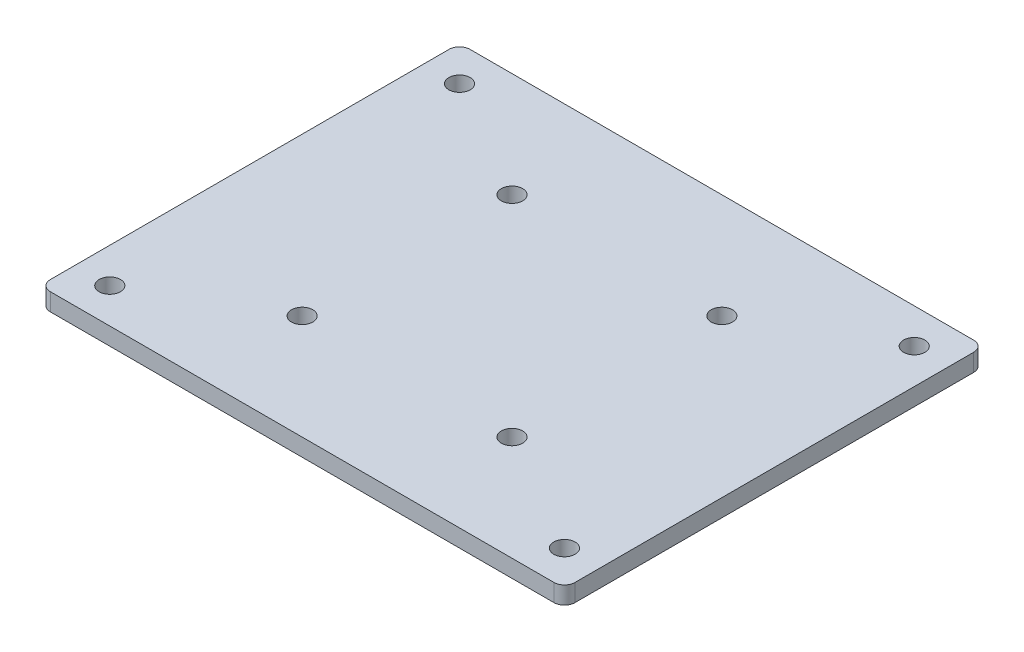
ISO-10303-21;
HEADER;
FILE_DESCRIPTION(('STEP AP214'),'2;1');
FILE_NAME('part.step','',(''),(''),'','','');
FILE_SCHEMA(('AUTOMOTIVE_DESIGN { 1 0 10303 214 1 1 1 1 }'));
ENDSEC;
DATA;
#1=APPLICATION_CONTEXT('core data for automotive mechanical design processes');
#2=APPLICATION_PROTOCOL_DEFINITION('international standard','automotive_design',2000,#1);
#3=PRODUCT_CONTEXT('',#1,'mechanical');
#4=PRODUCT('Part','Part','',(#3));
#5=PRODUCT_RELATED_PRODUCT_CATEGORY('part','',(#4));
#6=PRODUCT_DEFINITION_FORMATION('','',#4);
#7=PRODUCT_DEFINITION_CONTEXT('part definition',#1,'design');
#8=PRODUCT_DEFINITION('design','',#6,#7);
#9=PRODUCT_DEFINITION_SHAPE('','',#8);
#10=(LENGTH_UNIT() NAMED_UNIT(*) SI_UNIT(.MILLI.,.METRE.));
#11=(NAMED_UNIT(*) PLANE_ANGLE_UNIT() SI_UNIT($,.RADIAN.));
#12=(NAMED_UNIT(*) SI_UNIT($,.STERADIAN.) SOLID_ANGLE_UNIT());
#13=UNCERTAINTY_MEASURE_WITH_UNIT(LENGTH_MEASURE(1.E-05),#10,'distance_accuracy_value','');
#14=(GEOMETRIC_REPRESENTATION_CONTEXT(3) GLOBAL_UNCERTAINTY_ASSIGNED_CONTEXT((#13)) GLOBAL_UNIT_ASSIGNED_CONTEXT((#10,
#11,#12)) REPRESENTATION_CONTEXT('',''));
#15=CARTESIAN_POINT('',(0.,0.,0.));
#16=DIRECTION('',(0.,0.,1.));
#17=DIRECTION('',(1.,0.,0.));
#18=AXIS2_PLACEMENT_3D('',#15,#16,#17);
#19=CARTESIAN_POINT('',(75.,5.,-60.));
#20=DIRECTION('',(-1.,0.,0.));
#21=DIRECTION('',(0.,0.,1.));
#22=AXIS2_PLACEMENT_3D('',#19,#20,#21);
#23=PLANE('',#22);
#24=DIRECTION('',(0.,0.,-1.));
#25=VECTOR('',#24,1.);
#26=CARTESIAN_POINT('',(75.,0.,-60.));
#27=LINE('',#26,#25);
#28=CARTESIAN_POINT('',(75.,0.,57.));
#29=VERTEX_POINT('',#28);
#30=CARTESIAN_POINT('',(75.,0.,-57.));
#31=VERTEX_POINT('',#30);
#32=EDGE_CURVE('E140',#29,#31,#27,.T.);
#33=ORIENTED_EDGE('',*,*,#32,.T.);
#34=DIRECTION('',(0.,-1.,0.));
#35=VECTOR('',#34,1.);
#36=CARTESIAN_POINT('',(75.,5.,-57.));
#37=LINE('',#36,#35);
#38=CARTESIAN_POINT('',(75.,5.,-57.));
#39=VERTEX_POINT('',#38);
#40=EDGE_CURVE('E188',#31,#39,#37,.F.);
#41=ORIENTED_EDGE('',*,*,#40,.T.);
#42=DIRECTION('',(0.,0.,-1.));
#43=VECTOR('',#42,1.);
#44=CARTESIAN_POINT('',(75.,5.,-60.));
#45=LINE('',#44,#43);
#46=CARTESIAN_POINT('',(75.,5.,57.));
#47=VERTEX_POINT('',#46);
#48=EDGE_CURVE('E138',#47,#39,#45,.T.);
#49=ORIENTED_EDGE('',*,*,#48,.F.);
#50=DIRECTION('',(0.,-1.,0.));
#51=VECTOR('',#50,1.);
#52=CARTESIAN_POINT('',(75.,5.,57.));
#53=LINE('',#52,#51);
#54=EDGE_CURVE('E185',#47,#29,#53,.T.);
#55=ORIENTED_EDGE('',*,*,#54,.T.);
#56=EDGE_LOOP('',(#33,#41,#49,#55));
#57=FACE_BOUND('',#56,.T.);
#58=ADVANCED_FACE('F45',(#57),#23,.F.);
#59=CARTESIAN_POINT('',(-75.,5.,-60.));
#60=DIRECTION('',(0.,0.,1.));
#61=DIRECTION('',(1.,0.,0.));
#62=AXIS2_PLACEMENT_3D('',#59,#60,#61);
#63=PLANE('',#62);
#64=DIRECTION('',(-1.,0.,0.));
#65=VECTOR('',#64,1.);
#66=CARTESIAN_POINT('',(-75.,0.,-60.));
#67=LINE('',#66,#65);
#68=CARTESIAN_POINT('',(72.,0.,-60.));
#69=VERTEX_POINT('',#68);
#70=CARTESIAN_POINT('',(-72.,0.,-60.));
#71=VERTEX_POINT('',#70);
#72=EDGE_CURVE('E136',#69,#71,#67,.T.);
#73=ORIENTED_EDGE('',*,*,#72,.T.);
#74=DIRECTION('',(0.,-1.,0.));
#75=VECTOR('',#74,1.);
#76=CARTESIAN_POINT('',(-72.,5.,-60.));
#77=LINE('',#76,#75);
#78=CARTESIAN_POINT('',(-72.,5.,-60.));
#79=VERTEX_POINT('',#78);
#80=EDGE_CURVE('E115',#71,#79,#77,.F.);
#81=ORIENTED_EDGE('',*,*,#80,.T.);
#82=DIRECTION('',(-1.,0.,0.));
#83=VECTOR('',#82,1.);
#84=CARTESIAN_POINT('',(-75.,5.,-60.));
#85=LINE('',#84,#83);
#86=CARTESIAN_POINT('',(72.,5.,-60.));
#87=VERTEX_POINT('',#86);
#88=EDGE_CURVE('E204',#87,#79,#85,.T.);
#89=ORIENTED_EDGE('',*,*,#88,.F.);
#90=DIRECTION('',(0.,-1.,0.));
#91=VECTOR('',#90,1.);
#92=CARTESIAN_POINT('',(72.,5.,-60.));
#93=LINE('',#92,#91);
#94=EDGE_CURVE('E120',#87,#69,#93,.T.);
#95=ORIENTED_EDGE('',*,*,#94,.T.);
#96=EDGE_LOOP('',(#73,#81,#89,#95));
#97=FACE_BOUND('',#96,.T.);
#98=ADVANCED_FACE('F229',(#97),#63,.F.);
#99=CARTESIAN_POINT('',(-75.,5.,-60.));
#100=DIRECTION('',(1.,0.,0.));
#101=DIRECTION('',(0.,0.,-1.));
#102=AXIS2_PLACEMENT_3D('',#99,#100,#101);
#103=PLANE('',#102);
#104=DIRECTION('',(0.,0.,1.));
#105=VECTOR('',#104,1.);
#106=CARTESIAN_POINT('',(-75.,5.,-60.));
#107=LINE('',#106,#105);
#108=CARTESIAN_POINT('',(-75.,5.,-57.));
#109=VERTEX_POINT('',#108);
#110=CARTESIAN_POINT('',(-75.,5.,57.));
#111=VERTEX_POINT('',#110);
#112=EDGE_CURVE('E129',#109,#111,#107,.T.);
#113=ORIENTED_EDGE('',*,*,#112,.F.);
#114=DIRECTION('',(0.,-1.,0.));
#115=VECTOR('',#114,1.);
#116=CARTESIAN_POINT('',(-75.,5.,-57.));
#117=LINE('',#116,#115);
#118=CARTESIAN_POINT('',(-75.,0.,-57.));
#119=VERTEX_POINT('',#118);
#120=EDGE_CURVE('E114',#109,#119,#117,.T.);
#121=ORIENTED_EDGE('',*,*,#120,.T.);
#122=DIRECTION('',(0.,0.,1.));
#123=VECTOR('',#122,1.);
#124=CARTESIAN_POINT('',(-75.,0.,-60.));
#125=LINE('',#124,#123);
#126=CARTESIAN_POINT('',(-75.,0.,57.));
#127=VERTEX_POINT('',#126);
#128=EDGE_CURVE('E127',#119,#127,#125,.T.);
#129=ORIENTED_EDGE('',*,*,#128,.T.);
#130=DIRECTION('',(0.,-1.,0.));
#131=VECTOR('',#130,1.);
#132=CARTESIAN_POINT('',(-75.,5.,57.));
#133=LINE('',#132,#131);
#134=EDGE_CURVE('E131',#127,#111,#133,.F.);
#135=ORIENTED_EDGE('',*,*,#134,.T.);
#136=EDGE_LOOP('',(#113,#121,#129,#135));
#137=FACE_BOUND('',#136,.T.);
#138=ADVANCED_FACE('F126',(#137),#103,.F.);
#139=CARTESIAN_POINT('',(-75.,5.,60.));
#140=DIRECTION('',(0.,0.,-1.));
#141=DIRECTION('',(-1.,0.,0.));
#142=AXIS2_PLACEMENT_3D('',#139,#140,#141);
#143=PLANE('',#142);
#144=DIRECTION('',(1.,0.,0.));
#145=VECTOR('',#144,1.);
#146=CARTESIAN_POINT('',(-75.,0.,60.));
#147=LINE('',#146,#145);
#148=CARTESIAN_POINT('',(-72.,0.,60.));
#149=VERTEX_POINT('',#148);
#150=CARTESIAN_POINT('',(72.,0.,60.));
#151=VERTEX_POINT('',#150);
#152=EDGE_CURVE('E135',#149,#151,#147,.T.);
#153=ORIENTED_EDGE('',*,*,#152,.T.);
#154=DIRECTION('',(0.,-1.,0.));
#155=VECTOR('',#154,1.);
#156=CARTESIAN_POINT('',(72.,5.,60.));
#157=LINE('',#156,#155);
#158=CARTESIAN_POINT('',(72.,5.,60.));
#159=VERTEX_POINT('',#158);
#160=EDGE_CURVE('E11',#151,#159,#157,.F.);
#161=ORIENTED_EDGE('',*,*,#160,.T.);
#162=DIRECTION('',(1.,0.,0.));
#163=VECTOR('',#162,1.);
#164=CARTESIAN_POINT('',(-75.,5.,60.));
#165=LINE('',#164,#163);
#166=CARTESIAN_POINT('',(-72.,5.,60.));
#167=VERTEX_POINT('',#166);
#168=EDGE_CURVE('E169',#167,#159,#165,.T.);
#169=ORIENTED_EDGE('',*,*,#168,.F.);
#170=DIRECTION('',(0.,-1.,0.));
#171=VECTOR('',#170,1.);
#172=CARTESIAN_POINT('',(-72.,5.,60.));
#173=LINE('',#172,#171);
#174=EDGE_CURVE('E53',#167,#149,#173,.T.);
#175=ORIENTED_EDGE('',*,*,#174,.T.);
#176=EDGE_LOOP('',(#153,#161,#169,#175));
#177=FACE_BOUND('',#176,.T.);
#178=ADVANCED_FACE('F191',(#177),#143,.F.);
#179=CARTESIAN_POINT('',(0.,5.,0.));
#180=DIRECTION('',(0.,1.,0.));
#181=DIRECTION('',(0.,0.,1.));
#182=AXIS2_PLACEMENT_3D('',#179,#180,#181);
#183=PLANE('',#182);
#184=CARTESIAN_POINT('',(30.,5.,-30.));
#185=DIRECTION('',(0.,1.,0.));
#186=DIRECTION('',(0.,0.,1.));
#187=AXIS2_PLACEMENT_3D('',#184,#185,#186);
#188=CIRCLE('',#187,3.05);
#189=CARTESIAN_POINT('',(30.,5.,-26.95));
#190=VERTEX_POINT('',#189);
#191=EDGE_CURVE('E386',#190,#190,#188,.T.);
#192=ORIENTED_EDGE('',*,*,#191,.F.);
#193=EDGE_LOOP('',(#192));
#194=FACE_BOUND('',#193,.T.);
#195=CARTESIAN_POINT('',(30.,5.,30.));
#196=DIRECTION('',(0.,1.,0.));
#197=DIRECTION('',(0.,0.,1.));
#198=AXIS2_PLACEMENT_3D('',#195,#196,#197);
#199=CIRCLE('',#198,3.05);
#200=CARTESIAN_POINT('',(30.,5.,33.05));
#201=VERTEX_POINT('',#200);
#202=EDGE_CURVE('E388',#201,#201,#199,.T.);
#203=ORIENTED_EDGE('',*,*,#202,.F.);
#204=EDGE_LOOP('',(#203));
#205=FACE_BOUND('',#204,.T.);
#206=CARTESIAN_POINT('',(-30.,5.,30.));
#207=DIRECTION('',(0.,1.,0.));
#208=DIRECTION('',(0.,0.,1.));
#209=AXIS2_PLACEMENT_3D('',#206,#207,#208);
#210=CIRCLE('',#209,3.05);
#211=CARTESIAN_POINT('',(-30.,5.,33.05));
#212=VERTEX_POINT('',#211);
#213=EDGE_CURVE('E391',#212,#212,#210,.T.);
#214=ORIENTED_EDGE('',*,*,#213,.F.);
#215=EDGE_LOOP('',(#214));
#216=FACE_BOUND('',#215,.T.);
#217=CARTESIAN_POINT('',(-65.,5.,-50.));
#218=DIRECTION('',(0.,1.,0.));
#219=DIRECTION('',(0.,0.,1.));
#220=AXIS2_PLACEMENT_3D('',#217,#218,#219);
#221=CIRCLE('',#220,3.05);
#222=CARTESIAN_POINT('',(-65.,5.,-46.95));
#223=VERTEX_POINT('',#222);
#224=EDGE_CURVE('E398',#223,#223,#221,.T.);
#225=ORIENTED_EDGE('',*,*,#224,.F.);
#226=EDGE_LOOP('',(#225));
#227=FACE_BOUND('',#226,.T.);
#228=CARTESIAN_POINT('',(65.,5.,50.));
#229=DIRECTION('',(0.,1.,0.));
#230=DIRECTION('',(0.,0.,1.));
#231=AXIS2_PLACEMENT_3D('',#228,#229,#230);
#232=CIRCLE('',#231,3.04999999999999);
#233=CARTESIAN_POINT('',(65.,5.,53.05));
#234=VERTEX_POINT('',#233);
#235=EDGE_CURVE('E405',#234,#234,#232,.T.);
#236=ORIENTED_EDGE('',*,*,#235,.F.);
#237=EDGE_LOOP('',(#236));
#238=FACE_BOUND('',#237,.T.);
#239=CARTESIAN_POINT('',(-65.,5.,50.));
#240=DIRECTION('',(0.,1.,0.));
#241=DIRECTION('',(0.,0.,1.));
#242=AXIS2_PLACEMENT_3D('',#239,#240,#241);
#243=CIRCLE('',#242,3.05);
#244=CARTESIAN_POINT('',(-65.,5.,53.05));
#245=VERTEX_POINT('',#244);
#246=EDGE_CURVE('E394',#245,#245,#243,.T.);
#247=ORIENTED_EDGE('',*,*,#246,.F.);
#248=EDGE_LOOP('',(#247));
#249=FACE_BOUND('',#248,.T.);
#250=CARTESIAN_POINT('',(65.,5.,-50.));
#251=DIRECTION('',(0.,1.,0.));
#252=DIRECTION('',(0.,0.,1.));
#253=AXIS2_PLACEMENT_3D('',#250,#251,#252);
#254=CIRCLE('',#253,3.04999999999999);
#255=CARTESIAN_POINT('',(65.,5.,-46.95));
#256=VERTEX_POINT('',#255);
#257=EDGE_CURVE('E400',#256,#256,#254,.T.);
#258=ORIENTED_EDGE('',*,*,#257,.F.);
#259=EDGE_LOOP('',(#258));
#260=FACE_BOUND('',#259,.T.);
#261=CARTESIAN_POINT('',(-30.,5.,-30.));
#262=DIRECTION('',(0.,1.,0.));
#263=DIRECTION('',(0.,0.,1.));
#264=AXIS2_PLACEMENT_3D('',#261,#262,#263);
#265=CIRCLE('',#264,3.05);
#266=CARTESIAN_POINT('',(-30.,5.,-26.95));
#267=VERTEX_POINT('',#266);
#268=EDGE_CURVE('E148',#267,#267,#265,.T.);
#269=ORIENTED_EDGE('',*,*,#268,.F.);
#270=EDGE_LOOP('',(#269));
#271=FACE_BOUND('',#270,.T.);
#272=ORIENTED_EDGE('',*,*,#88,.T.);
#273=CARTESIAN_POINT('',(-72.,5.,-57.));
#274=DIRECTION('',(0.,1.,0.));
#275=DIRECTION('',(0.,0.,1.));
#276=AXIS2_PLACEMENT_3D('',#273,#274,#275);
#277=CIRCLE('',#276,3.);
#278=EDGE_CURVE('E183',#79,#109,#277,.T.);
#279=ORIENTED_EDGE('',*,*,#278,.T.);
#280=ORIENTED_EDGE('',*,*,#112,.T.);
#281=CARTESIAN_POINT('',(-72.,5.,57.));
#282=DIRECTION('',(0.,1.,0.));
#283=DIRECTION('',(0.,0.,1.));
#284=AXIS2_PLACEMENT_3D('',#281,#282,#283);
#285=CIRCLE('',#284,3.);
#286=EDGE_CURVE('E65',#111,#167,#285,.T.);
#287=ORIENTED_EDGE('',*,*,#286,.T.);
#288=ORIENTED_EDGE('',*,*,#168,.T.);
#289=CARTESIAN_POINT('',(72.,5.,57.));
#290=DIRECTION('',(0.,1.,0.));
#291=DIRECTION('',(0.,0.,1.));
#292=AXIS2_PLACEMENT_3D('',#289,#290,#291);
#293=CIRCLE('',#292,3.);
#294=EDGE_CURVE('E179',#159,#47,#293,.T.);
#295=ORIENTED_EDGE('',*,*,#294,.T.);
#296=ORIENTED_EDGE('',*,*,#48,.T.);
#297=CARTESIAN_POINT('',(72.,5.,-57.));
#298=DIRECTION('',(0.,1.,0.));
#299=DIRECTION('',(0.,0.,1.));
#300=AXIS2_PLACEMENT_3D('',#297,#298,#299);
#301=CIRCLE('',#300,3.);
#302=EDGE_CURVE('E181',#39,#87,#301,.T.);
#303=ORIENTED_EDGE('',*,*,#302,.T.);
#304=EDGE_LOOP('',(#272,#279,#280,#287,#288,#295,#296,#303));
#305=FACE_BOUND('',#304,.T.);
#306=ADVANCED_FACE('F212',(#194,#205,#216,#227,#238,#249,#260,#271,#305),#183,.T.);
#307=CARTESIAN_POINT('',(0.,0.,0.));
#308=DIRECTION('',(0.,1.,0.));
#309=DIRECTION('',(0.,0.,1.));
#310=AXIS2_PLACEMENT_3D('',#307,#308,#309);
#311=PLANE('',#310);
#312=CARTESIAN_POINT('',(30.,0.,-30.));
#313=DIRECTION('',(0.,1.,0.));
#314=DIRECTION('',(0.,0.,1.));
#315=AXIS2_PLACEMENT_3D('',#312,#313,#314);
#316=CIRCLE('',#315,3.05);
#317=CARTESIAN_POINT('',(30.,0.,-26.95));
#318=VERTEX_POINT('',#317);
#319=EDGE_CURVE('E166',#318,#318,#316,.T.);
#320=ORIENTED_EDGE('',*,*,#319,.T.);
#321=EDGE_LOOP('',(#320));
#322=FACE_BOUND('',#321,.T.);
#323=CARTESIAN_POINT('',(30.,0.,30.));
#324=DIRECTION('',(0.,1.,0.));
#325=DIRECTION('',(0.,0.,1.));
#326=AXIS2_PLACEMENT_3D('',#323,#324,#325);
#327=CIRCLE('',#326,3.05);
#328=CARTESIAN_POINT('',(30.,0.,33.05));
#329=VERTEX_POINT('',#328);
#330=EDGE_CURVE('E163',#329,#329,#327,.T.);
#331=ORIENTED_EDGE('',*,*,#330,.T.);
#332=EDGE_LOOP('',(#331));
#333=FACE_BOUND('',#332,.T.);
#334=CARTESIAN_POINT('',(-30.,0.,30.));
#335=DIRECTION('',(0.,1.,0.));
#336=DIRECTION('',(0.,0.,1.));
#337=AXIS2_PLACEMENT_3D('',#334,#335,#336);
#338=CIRCLE('',#337,3.05);
#339=CARTESIAN_POINT('',(-30.,0.,33.05));
#340=VERTEX_POINT('',#339);
#341=EDGE_CURVE('E160',#340,#340,#338,.T.);
#342=ORIENTED_EDGE('',*,*,#341,.T.);
#343=EDGE_LOOP('',(#342));
#344=FACE_BOUND('',#343,.T.);
#345=CARTESIAN_POINT('',(-65.,0.,-50.));
#346=DIRECTION('',(0.,1.,0.));
#347=DIRECTION('',(0.,0.,1.));
#348=AXIS2_PLACEMENT_3D('',#345,#346,#347);
#349=CIRCLE('',#348,3.05);
#350=CARTESIAN_POINT('',(-65.,0.,-46.95));
#351=VERTEX_POINT('',#350);
#352=EDGE_CURVE('E157',#351,#351,#349,.T.);
#353=ORIENTED_EDGE('',*,*,#352,.T.);
#354=EDGE_LOOP('',(#353));
#355=FACE_BOUND('',#354,.T.);
#356=CARTESIAN_POINT('',(65.,0.,50.));
#357=DIRECTION('',(0.,1.,0.));
#358=DIRECTION('',(0.,0.,1.));
#359=AXIS2_PLACEMENT_3D('',#356,#357,#358);
#360=CIRCLE('',#359,3.04999999999999);
#361=CARTESIAN_POINT('',(65.,0.,53.05));
#362=VERTEX_POINT('',#361);
#363=EDGE_CURVE('E154',#362,#362,#360,.T.);
#364=ORIENTED_EDGE('',*,*,#363,.T.);
#365=EDGE_LOOP('',(#364));
#366=FACE_BOUND('',#365,.T.);
#367=CARTESIAN_POINT('',(-65.,0.,50.));
#368=DIRECTION('',(0.,1.,0.));
#369=DIRECTION('',(0.,0.,1.));
#370=AXIS2_PLACEMENT_3D('',#367,#368,#369);
#371=CIRCLE('',#370,3.05);
#372=CARTESIAN_POINT('',(-65.,0.,53.05));
#373=VERTEX_POINT('',#372);
#374=EDGE_CURVE('E151',#373,#373,#371,.T.);
#375=ORIENTED_EDGE('',*,*,#374,.T.);
#376=EDGE_LOOP('',(#375));
#377=FACE_BOUND('',#376,.T.);
#378=CARTESIAN_POINT('',(65.,0.,-50.));
#379=DIRECTION('',(0.,1.,0.));
#380=DIRECTION('',(0.,0.,1.));
#381=AXIS2_PLACEMENT_3D('',#378,#379,#380);
#382=CIRCLE('',#381,3.04999999999999);
#383=CARTESIAN_POINT('',(65.,0.,-46.95));
#384=VERTEX_POINT('',#383);
#385=EDGE_CURVE('E147',#384,#384,#382,.T.);
#386=ORIENTED_EDGE('',*,*,#385,.T.);
#387=EDGE_LOOP('',(#386));
#388=FACE_BOUND('',#387,.T.);
#389=CARTESIAN_POINT('',(-30.,0.,-30.));
#390=DIRECTION('',(0.,1.,0.));
#391=DIRECTION('',(0.,0.,1.));
#392=AXIS2_PLACEMENT_3D('',#389,#390,#391);
#393=CIRCLE('',#392,3.05);
#394=CARTESIAN_POINT('',(-30.,0.,-26.95));
#395=VERTEX_POINT('',#394);
#396=EDGE_CURVE('E144',#395,#395,#393,.T.);
#397=ORIENTED_EDGE('',*,*,#396,.T.);
#398=EDGE_LOOP('',(#397));
#399=FACE_BOUND('',#398,.T.);
#400=ORIENTED_EDGE('',*,*,#128,.F.);
#401=CARTESIAN_POINT('',(-72.,0.,-57.));
#402=DIRECTION('',(0.,1.,0.));
#403=DIRECTION('',(0.,0.,1.));
#404=AXIS2_PLACEMENT_3D('',#401,#402,#403);
#405=CIRCLE('',#404,3.);
#406=EDGE_CURVE('E110',#119,#71,#405,.F.);
#407=ORIENTED_EDGE('',*,*,#406,.T.);
#408=ORIENTED_EDGE('',*,*,#72,.F.);
#409=CARTESIAN_POINT('',(72.,0.,-57.));
#410=DIRECTION('',(0.,1.,0.));
#411=DIRECTION('',(0.,0.,1.));
#412=AXIS2_PLACEMENT_3D('',#409,#410,#411);
#413=CIRCLE('',#412,3.);
#414=EDGE_CURVE('E121',#69,#31,#413,.F.);
#415=ORIENTED_EDGE('',*,*,#414,.T.);
#416=ORIENTED_EDGE('',*,*,#32,.F.);
#417=CARTESIAN_POINT('',(72.,0.,57.));
#418=DIRECTION('',(0.,1.,0.));
#419=DIRECTION('',(0.,0.,1.));
#420=AXIS2_PLACEMENT_3D('',#417,#418,#419);
#421=CIRCLE('',#420,3.);
#422=EDGE_CURVE('E172',#29,#151,#421,.F.);
#423=ORIENTED_EDGE('',*,*,#422,.T.);
#424=ORIENTED_EDGE('',*,*,#152,.F.);
#425=CARTESIAN_POINT('',(-72.,0.,57.));
#426=DIRECTION('',(0.,1.,0.));
#427=DIRECTION('',(0.,0.,1.));
#428=AXIS2_PLACEMENT_3D('',#425,#426,#427);
#429=CIRCLE('',#428,3.);
#430=EDGE_CURVE('E130',#149,#127,#429,.F.);
#431=ORIENTED_EDGE('',*,*,#430,.T.);
#432=EDGE_LOOP('',(#400,#407,#408,#415,#416,#423,#424,#431));
#433=FACE_BOUND('',#432,.T.);
#434=ADVANCED_FACE('F133',(#322,#333,#344,#355,#366,#377,#388,#399,#433),#311,.F.);
#435=CARTESIAN_POINT('',(-30.,-5.,-30.));
#436=DIRECTION('',(0.,1.,0.));
#437=DIRECTION('',(0.,0.,1.));
#438=AXIS2_PLACEMENT_3D('',#435,#436,#437);
#439=CYLINDRICAL_SURFACE('',#438,3.05);
#440=ORIENTED_EDGE('',*,*,#268,.T.);
#441=EDGE_LOOP('',(#440));
#442=FACE_BOUND('',#441,.T.);
#443=ORIENTED_EDGE('',*,*,#396,.F.);
#444=EDGE_LOOP('',(#443));
#445=FACE_BOUND('',#444,.T.);
#446=ADVANCED_FACE('F221',(#442,#445),#439,.F.);
#447=CARTESIAN_POINT('',(65.,-5.,-50.));
#448=DIRECTION('',(0.,1.,0.));
#449=DIRECTION('',(0.,0.,1.));
#450=AXIS2_PLACEMENT_3D('',#447,#448,#449);
#451=CYLINDRICAL_SURFACE('',#450,3.04999999999999);
#452=ORIENTED_EDGE('',*,*,#257,.T.);
#453=EDGE_LOOP('',(#452));
#454=FACE_BOUND('',#453,.T.);
#455=ORIENTED_EDGE('',*,*,#385,.F.);
#456=EDGE_LOOP('',(#455));
#457=FACE_BOUND('',#456,.T.);
#458=ADVANCED_FACE('F326',(#454,#457),#451,.F.);
#459=CARTESIAN_POINT('',(-65.,-5.,50.));
#460=DIRECTION('',(0.,1.,0.));
#461=DIRECTION('',(0.,0.,1.));
#462=AXIS2_PLACEMENT_3D('',#459,#460,#461);
#463=CYLINDRICAL_SURFACE('',#462,3.05);
#464=ORIENTED_EDGE('',*,*,#246,.T.);
#465=EDGE_LOOP('',(#464));
#466=FACE_BOUND('',#465,.T.);
#467=ORIENTED_EDGE('',*,*,#374,.F.);
#468=EDGE_LOOP('',(#467));
#469=FACE_BOUND('',#468,.T.);
#470=ADVANCED_FACE('F316',(#466,#469),#463,.F.);
#471=CARTESIAN_POINT('',(65.,-5.,50.));
#472=DIRECTION('',(0.,1.,0.));
#473=DIRECTION('',(0.,0.,1.));
#474=AXIS2_PLACEMENT_3D('',#471,#472,#473);
#475=CYLINDRICAL_SURFACE('',#474,3.04999999999999);
#476=ORIENTED_EDGE('',*,*,#235,.T.);
#477=EDGE_LOOP('',(#476));
#478=FACE_BOUND('',#477,.T.);
#479=ORIENTED_EDGE('',*,*,#363,.F.);
#480=EDGE_LOOP('',(#479));
#481=FACE_BOUND('',#480,.T.);
#482=ADVANCED_FACE('F306',(#478,#481),#475,.F.);
#483=CARTESIAN_POINT('',(-65.,-5.,-50.));
#484=DIRECTION('',(0.,1.,0.));
#485=DIRECTION('',(0.,0.,1.));
#486=AXIS2_PLACEMENT_3D('',#483,#484,#485);
#487=CYLINDRICAL_SURFACE('',#486,3.05);
#488=ORIENTED_EDGE('',*,*,#224,.T.);
#489=EDGE_LOOP('',(#488));
#490=FACE_BOUND('',#489,.T.);
#491=ORIENTED_EDGE('',*,*,#352,.F.);
#492=EDGE_LOOP('',(#491));
#493=FACE_BOUND('',#492,.T.);
#494=ADVANCED_FACE('F296',(#490,#493),#487,.F.);
#495=CARTESIAN_POINT('',(-30.,-5.,30.));
#496=DIRECTION('',(0.,1.,0.));
#497=DIRECTION('',(0.,0.,1.));
#498=AXIS2_PLACEMENT_3D('',#495,#496,#497);
#499=CYLINDRICAL_SURFACE('',#498,3.05);
#500=ORIENTED_EDGE('',*,*,#213,.T.);
#501=EDGE_LOOP('',(#500));
#502=FACE_BOUND('',#501,.T.);
#503=ORIENTED_EDGE('',*,*,#341,.F.);
#504=EDGE_LOOP('',(#503));
#505=FACE_BOUND('',#504,.T.);
#506=ADVANCED_FACE('F286',(#502,#505),#499,.F.);
#507=CARTESIAN_POINT('',(30.,-5.,30.));
#508=DIRECTION('',(0.,1.,0.));
#509=DIRECTION('',(0.,0.,1.));
#510=AXIS2_PLACEMENT_3D('',#507,#508,#509);
#511=CYLINDRICAL_SURFACE('',#510,3.05);
#512=ORIENTED_EDGE('',*,*,#202,.T.);
#513=EDGE_LOOP('',(#512));
#514=FACE_BOUND('',#513,.T.);
#515=ORIENTED_EDGE('',*,*,#330,.F.);
#516=EDGE_LOOP('',(#515));
#517=FACE_BOUND('',#516,.T.);
#518=ADVANCED_FACE('F276',(#514,#517),#511,.F.);
#519=CARTESIAN_POINT('',(30.,-5.,-30.));
#520=DIRECTION('',(0.,1.,0.));
#521=DIRECTION('',(0.,0.,1.));
#522=AXIS2_PLACEMENT_3D('',#519,#520,#521);
#523=CYLINDRICAL_SURFACE('',#522,3.05);
#524=ORIENTED_EDGE('',*,*,#191,.T.);
#525=EDGE_LOOP('',(#524));
#526=FACE_BOUND('',#525,.T.);
#527=ORIENTED_EDGE('',*,*,#319,.F.);
#528=EDGE_LOOP('',(#527));
#529=FACE_BOUND('',#528,.T.);
#530=ADVANCED_FACE('F242',(#526,#529),#523,.F.);
#531=CARTESIAN_POINT('',(-72.,5.,-57.));
#532=DIRECTION('',(0.,-1.,0.));
#533=DIRECTION('',(0.,0.,-1.));
#534=AXIS2_PLACEMENT_3D('',#531,#532,#533);
#535=CYLINDRICAL_SURFACE('',#534,3.);
#536=ORIENTED_EDGE('',*,*,#278,.F.);
#537=ORIENTED_EDGE('',*,*,#80,.F.);
#538=ORIENTED_EDGE('',*,*,#406,.F.);
#539=ORIENTED_EDGE('',*,*,#120,.F.);
#540=EDGE_LOOP('',(#536,#537,#538,#539));
#541=FACE_BOUND('',#540,.T.);
#542=ADVANCED_FACE('F113',(#541),#535,.T.);
#543=CARTESIAN_POINT('',(72.,5.,-57.));
#544=DIRECTION('',(0.,-1.,0.));
#545=DIRECTION('',(0.,0.,-1.));
#546=AXIS2_PLACEMENT_3D('',#543,#544,#545);
#547=CYLINDRICAL_SURFACE('',#546,3.);
#548=ORIENTED_EDGE('',*,*,#302,.F.);
#549=ORIENTED_EDGE('',*,*,#40,.F.);
#550=ORIENTED_EDGE('',*,*,#414,.F.);
#551=ORIENTED_EDGE('',*,*,#94,.F.);
#552=EDGE_LOOP('',(#548,#549,#550,#551));
#553=FACE_BOUND('',#552,.T.);
#554=ADVANCED_FACE('F241',(#553),#547,.T.);
#555=CARTESIAN_POINT('',(72.,5.,57.));
#556=DIRECTION('',(0.,-1.,0.));
#557=DIRECTION('',(0.,0.,-1.));
#558=AXIS2_PLACEMENT_3D('',#555,#556,#557);
#559=CYLINDRICAL_SURFACE('',#558,3.);
#560=ORIENTED_EDGE('',*,*,#294,.F.);
#561=ORIENTED_EDGE('',*,*,#160,.F.);
#562=ORIENTED_EDGE('',*,*,#422,.F.);
#563=ORIENTED_EDGE('',*,*,#54,.F.);
#564=EDGE_LOOP('',(#560,#561,#562,#563));
#565=FACE_BOUND('',#564,.T.);
#566=ADVANCED_FACE('F198',(#565),#559,.T.);
#567=CARTESIAN_POINT('',(-72.,5.,57.));
#568=DIRECTION('',(0.,-1.,0.));
#569=DIRECTION('',(0.,0.,-1.));
#570=AXIS2_PLACEMENT_3D('',#567,#568,#569);
#571=CYLINDRICAL_SURFACE('',#570,3.);
#572=ORIENTED_EDGE('',*,*,#286,.F.);
#573=ORIENTED_EDGE('',*,*,#134,.F.);
#574=ORIENTED_EDGE('',*,*,#430,.F.);
#575=ORIENTED_EDGE('',*,*,#174,.F.);
#576=EDGE_LOOP('',(#572,#573,#574,#575));
#577=FACE_BOUND('',#576,.T.);
#578=ADVANCED_FACE('F47',(#577),#571,.T.);
#579=CLOSED_SHELL('',(#58,#98,#138,#178,#306,#434,#446,#458,#470,#482,#494,#506,#518,#530,#542,
#554,#566,#578));
#580=MANIFOLD_SOLID_BREP('B2',#579);
#581=ADVANCED_BREP_SHAPE_REPRESENTATION('',(#18,#580),#14);
#582=SHAPE_DEFINITION_REPRESENTATION(#9,#581);
ENDSEC;
END-ISO-10303-21;
